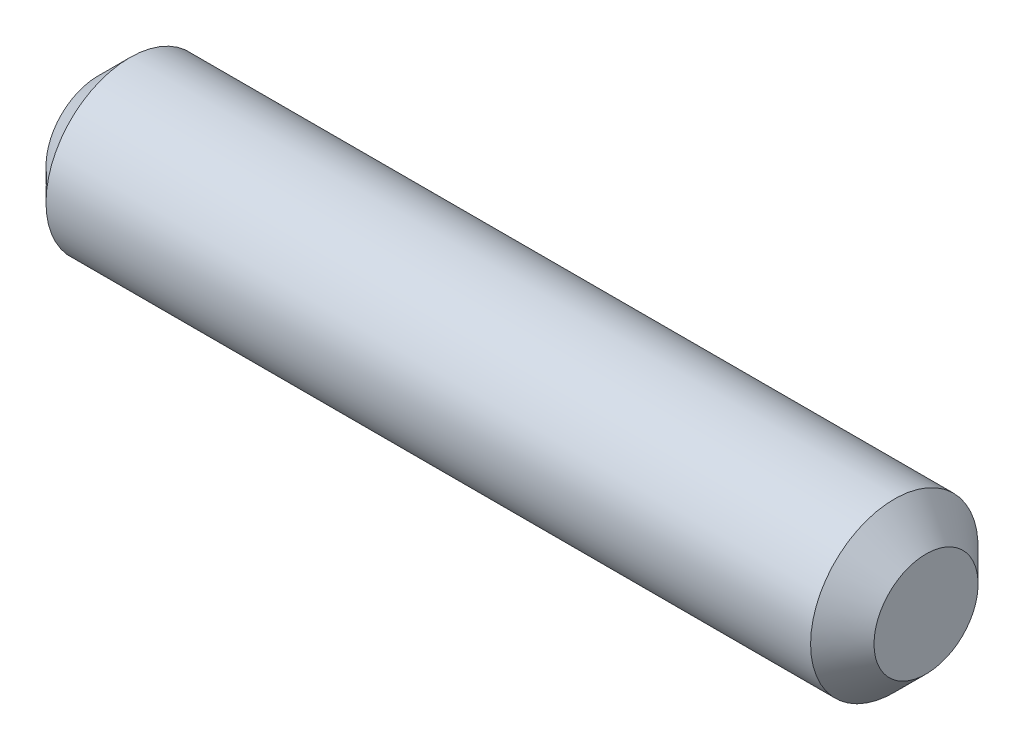
ISO-10303-21;
HEADER;
FILE_DESCRIPTION(('STEP AP214'),'2;1');
FILE_NAME('part.step','',(''),(''),'','','');
FILE_SCHEMA(('AUTOMOTIVE_DESIGN { 1 0 10303 214 1 1 1 1 }'));
ENDSEC;
DATA;
#1=APPLICATION_CONTEXT('core data for automotive mechanical design processes');
#2=APPLICATION_PROTOCOL_DEFINITION('international standard','automotive_design',2000,#1);
#3=PRODUCT_CONTEXT('',#1,'mechanical');
#4=PRODUCT('Part','Part','',(#3));
#5=PRODUCT_RELATED_PRODUCT_CATEGORY('part','',(#4));
#6=PRODUCT_DEFINITION_FORMATION('','',#4);
#7=PRODUCT_DEFINITION_CONTEXT('part definition',#1,'design');
#8=PRODUCT_DEFINITION('design','',#6,#7);
#9=PRODUCT_DEFINITION_SHAPE('','',#8);
#10=(LENGTH_UNIT() NAMED_UNIT(*) SI_UNIT(.MILLI.,.METRE.));
#11=(NAMED_UNIT(*) PLANE_ANGLE_UNIT() SI_UNIT($,.RADIAN.));
#12=(NAMED_UNIT(*) SI_UNIT($,.STERADIAN.) SOLID_ANGLE_UNIT());
#13=UNCERTAINTY_MEASURE_WITH_UNIT(LENGTH_MEASURE(1.E-05),#10,'distance_accuracy_value','');
#14=(GEOMETRIC_REPRESENTATION_CONTEXT(3) GLOBAL_UNCERTAINTY_ASSIGNED_CONTEXT((#13)) GLOBAL_UNIT_ASSIGNED_CONTEXT((#10,
#11,#12)) REPRESENTATION_CONTEXT('',''));
#15=CARTESIAN_POINT('',(0.,0.,0.));
#16=DIRECTION('',(0.,0.,1.));
#17=DIRECTION('',(1.,0.,0.));
#18=AXIS2_PLACEMENT_3D('',#15,#16,#17);
#19=CARTESIAN_POINT('',(7.835,0.,0.));
#20=DIRECTION('',(-1.,0.,0.));
#21=DIRECTION('',(0.,0.,1.));
#22=AXIS2_PLACEMENT_3D('',#19,#20,#21);
#23=CYLINDRICAL_SURFACE('',#22,1.585);
#24=CARTESIAN_POINT('',(7.235,0.,0.));
#25=DIRECTION('',(1.,0.,0.));
#26=DIRECTION('',(0.,0.,-1.));
#27=AXIS2_PLACEMENT_3D('',#24,#25,#26);
#28=CIRCLE('',#27,1.585);
#29=CARTESIAN_POINT('',(7.235,0.,1.585));
#30=VERTEX_POINT('',#29);
#31=EDGE_CURVE('E41',#30,#30,#28,.F.);
#32=ORIENTED_EDGE('',*,*,#31,.T.);
#33=EDGE_LOOP('',(#32));
#34=FACE_BOUND('',#33,.T.);
#35=CARTESIAN_POINT('',(-7.235,0.,0.));
#36=DIRECTION('',(1.,0.,0.));
#37=DIRECTION('',(0.,0.,-1.));
#38=AXIS2_PLACEMENT_3D('',#35,#36,#37);
#39=CIRCLE('',#38,1.585);
#40=CARTESIAN_POINT('',(-7.235,0.,-1.585));
#41=VERTEX_POINT('',#40);
#42=EDGE_CURVE('E45',#41,#41,#39,.T.);
#43=ORIENTED_EDGE('',*,*,#42,.T.);
#44=EDGE_LOOP('',(#43));
#45=FACE_BOUND('',#44,.T.);
#46=ADVANCED_FACE('F33',(#34,#45),#23,.T.);
#47=CARTESIAN_POINT('',(7.835,0.,0.));
#48=DIRECTION('',(1.,0.,0.));
#49=DIRECTION('',(0.,0.,-1.));
#50=AXIS2_PLACEMENT_3D('',#47,#48,#49);
#51=PLANE('',#50);
#52=CARTESIAN_POINT('',(7.835,0.,0.));
#53=DIRECTION('',(1.,0.,0.));
#54=DIRECTION('',(0.,0.,-1.));
#55=AXIS2_PLACEMENT_3D('',#52,#53,#54);
#56=CIRCLE('',#55,0.985000000000003);
#57=CARTESIAN_POINT('',(7.835,0.,0.985000000000004));
#58=VERTEX_POINT('',#57);
#59=EDGE_CURVE('E49',#58,#58,#56,.T.);
#60=ORIENTED_EDGE('',*,*,#59,.T.);
#61=EDGE_LOOP('',(#60));
#62=FACE_BOUND('',#61,.T.);
#63=ADVANCED_FACE('F55',(#62),#51,.T.);
#64=CARTESIAN_POINT('',(-7.835,0.,0.));
#65=DIRECTION('',(1.,0.,0.));
#66=DIRECTION('',(0.,0.,-1.));
#67=AXIS2_PLACEMENT_3D('',#64,#65,#66);
#68=PLANE('',#67);
#69=CARTESIAN_POINT('',(-7.835,0.,0.));
#70=DIRECTION('',(1.,0.,0.));
#71=DIRECTION('',(0.,0.,-1.));
#72=AXIS2_PLACEMENT_3D('',#69,#70,#71);
#73=CIRCLE('',#72,0.984999999999998);
#74=CARTESIAN_POINT('',(-7.835,0.,-0.984999999999998));
#75=VERTEX_POINT('',#74);
#76=EDGE_CURVE('E10',#75,#75,#73,.F.);
#77=ORIENTED_EDGE('',*,*,#76,.T.);
#78=EDGE_LOOP('',(#77));
#79=FACE_BOUND('',#78,.T.);
#80=ADVANCED_FACE('F59',(#79),#68,.F.);
#81=CARTESIAN_POINT('',(7.835,0.,0.));
#82=DIRECTION('',(-1.,0.,0.));
#83=DIRECTION('',(0.,0.,1.));
#84=AXIS2_PLACEMENT_3D('',#81,#82,#83);
#85=CONICAL_SURFACE('',#84,0.985000000000003,0.785398163397448);
#86=CARTESIAN_POINT('',(7.235,0.,1.585));
#87=CARTESIAN_POINT('',(7.24125,0.,1.57875));
#88=CARTESIAN_POINT('',(7.2475,0.,1.5725));
#89=CARTESIAN_POINT('',(7.26,0.,1.56));
#90=CARTESIAN_POINT('',(7.26625,0.,1.55375));
#91=CARTESIAN_POINT('',(7.27875,0.,1.54125));
#92=CARTESIAN_POINT('',(7.285,0.,1.535));
#93=CARTESIAN_POINT('',(7.2975,0.,1.5225));
#94=CARTESIAN_POINT('',(7.30375,0.,1.51625));
#95=CARTESIAN_POINT('',(7.31625,0.,1.50375));
#96=CARTESIAN_POINT('',(7.3225,0.,1.4975));
#97=CARTESIAN_POINT('',(7.335,0.,1.485));
#98=CARTESIAN_POINT('',(7.34125,0.,1.47875));
#99=CARTESIAN_POINT('',(7.35375,0.,1.46625));
#100=CARTESIAN_POINT('',(7.36,0.,1.46));
#101=CARTESIAN_POINT('',(7.3725,0.,1.4475));
#102=CARTESIAN_POINT('',(7.37875,0.,1.44125));
#103=CARTESIAN_POINT('',(7.39125,0.,1.42875));
#104=CARTESIAN_POINT('',(7.3975,0.,1.4225));
#105=CARTESIAN_POINT('',(7.41,0.,1.41));
#106=CARTESIAN_POINT('',(7.41625,0.,1.40375));
#107=CARTESIAN_POINT('',(7.42875,0.,1.39125));
#108=CARTESIAN_POINT('',(7.435,0.,1.385));
#109=CARTESIAN_POINT('',(7.4475,0.,1.3725));
#110=CARTESIAN_POINT('',(7.45375,0.,1.36625));
#111=CARTESIAN_POINT('',(7.46625,0.,1.35375));
#112=CARTESIAN_POINT('',(7.4725,0.,1.3475));
#113=CARTESIAN_POINT('',(7.485,0.,1.335));
#114=CARTESIAN_POINT('',(7.49125,0.,1.32875));
#115=CARTESIAN_POINT('',(7.50375,0.,1.31625));
#116=CARTESIAN_POINT('',(7.51,0.,1.31));
#117=CARTESIAN_POINT('',(7.5225,0.,1.2975));
#118=CARTESIAN_POINT('',(7.52875,0.,1.29125));
#119=CARTESIAN_POINT('',(7.54125,0.,1.27875));
#120=CARTESIAN_POINT('',(7.5475,0.,1.2725));
#121=CARTESIAN_POINT('',(7.56,0.,1.26));
#122=CARTESIAN_POINT('',(7.56625,0.,1.25375));
#123=CARTESIAN_POINT('',(7.57875,0.,1.24125));
#124=CARTESIAN_POINT('',(7.585,0.,1.235));
#125=CARTESIAN_POINT('',(7.5975,0.,1.2225));
#126=CARTESIAN_POINT('',(7.60375,0.,1.21625));
#127=CARTESIAN_POINT('',(7.61625,0.,1.20375));
#128=CARTESIAN_POINT('',(7.6225,0.,1.1975));
#129=CARTESIAN_POINT('',(7.635,0.,1.185));
#130=CARTESIAN_POINT('',(7.64125,0.,1.17875));
#131=CARTESIAN_POINT('',(7.65375,0.,1.16625));
#132=CARTESIAN_POINT('',(7.66,0.,1.16));
#133=CARTESIAN_POINT('',(7.6725,0.,1.1475));
#134=CARTESIAN_POINT('',(7.67875,0.,1.14125));
#135=CARTESIAN_POINT('',(7.69125,0.,1.12875));
#136=CARTESIAN_POINT('',(7.6975,0.,1.1225));
#137=CARTESIAN_POINT('',(7.71,0.,1.11));
#138=CARTESIAN_POINT('',(7.71625,0.,1.10375));
#139=CARTESIAN_POINT('',(7.72875,0.,1.09125));
#140=CARTESIAN_POINT('',(7.735,0.,1.085));
#141=CARTESIAN_POINT('',(7.7475,0.,1.0725));
#142=CARTESIAN_POINT('',(7.75375,0.,1.06625));
#143=CARTESIAN_POINT('',(7.76625,0.,1.05375));
#144=CARTESIAN_POINT('',(7.7725,0.,1.0475));
#145=CARTESIAN_POINT('',(7.785,0.,1.035));
#146=CARTESIAN_POINT('',(7.79125,0.,1.02875));
#147=CARTESIAN_POINT('',(7.80375,0.,1.01625));
#148=CARTESIAN_POINT('',(7.81,0.,1.01));
#149=CARTESIAN_POINT('',(7.8225,0.,0.997500000000004));
#150=CARTESIAN_POINT('',(7.82875,0.,0.991250000000004));
#151=CARTESIAN_POINT('',(7.835,0.,0.985000000000004));
#152=B_SPLINE_CURVE_WITH_KNOTS('',3,(#86,#87,#88,#89,#90,#91,#92,#93,#94,#95,#96,#97,#98,#99,
#100,#101,#102,#103,#104,#105,#106,#107,#108,#109,#110,#111,#112,#113,#114,#115,#116,#117,#118,
#119,#120,#121,#122,#123,#124,#125,#126,#127,#128,#129,#130,#131,#132,#133,#134,#135,#136,#137,
#138,#139,#140,#141,#142,#143,#144,#145,#146,#147,#148,#149,#150,#151),.UNSPECIFIED.,.F.,.F.,(4,
2,2,2,2,2,2,2,2,2,2,2,2,2,2,2,2,2,2,2,2,2,2,2,2,2,2,2,2,2,2,2,4),(0.,0.0265165042944952,
0.0530330085889904,0.0795495128834857,0.106066017177981,0.132582521472477,0.159099025766972,
0.185615530061467,0.212132034355963,0.238648538650458,0.265165042944953,0.291681547239449,
0.318198051533944,0.34471455582844,0.371231060122935,0.397747564417431,0.424264068711926,
0.450780573006421,0.477297077300916,0.503813581595412,0.530330085889907,0.556846590184403,
0.583363094478898,0.609879598773394,0.636396103067889,0.662912607362384,0.689429111656879,
0.715945615951375,0.74246212024587,0.768978624540366,0.795495128834861,0.822011633129356,
0.848528137423852),.UNSPECIFIED.);
#153=EDGE_CURVE('BSEAM57',#30,#58,#152,.T.);
#154=ORIENTED_EDGE('',*,*,#31,.F.);
#155=ORIENTED_EDGE('',*,*,#59,.F.);
#156=ORIENTED_EDGE('',*,*,#153,.T.);
#157=ORIENTED_EDGE('',*,*,#153,.F.);
#158=EDGE_LOOP('',(#154,#156,#155,#157));
#159=FACE_BOUND('',#158,.T.);
#160=ADVANCED_FACE('F57',(#159),#85,.T.);
#161=CARTESIAN_POINT('',(-7.235,0.,0.));
#162=DIRECTION('',(1.,0.,0.));
#163=DIRECTION('',(0.,0.,-1.));
#164=AXIS2_PLACEMENT_3D('',#161,#162,#163);
#165=CONICAL_SURFACE('',#164,1.585,0.78539816339745);
#166=ORIENTED_EDGE('',*,*,#76,.F.);
#167=EDGE_LOOP('',(#166));
#168=FACE_BOUND('',#167,.T.);
#169=ORIENTED_EDGE('',*,*,#42,.F.);
#170=EDGE_LOOP('',(#169));
#171=FACE_BOUND('',#170,.T.);
#172=ADVANCED_FACE('F36',(#168,#171),#165,.T.);
#173=CLOSED_SHELL('',(#46,#63,#80,#160,#172));
#174=MANIFOLD_SOLID_BREP('B2',#173);
#175=ADVANCED_BREP_SHAPE_REPRESENTATION('',(#18,#174),#14);
#176=SHAPE_DEFINITION_REPRESENTATION(#9,#175);
ENDSEC;
END-ISO-10303-21;
